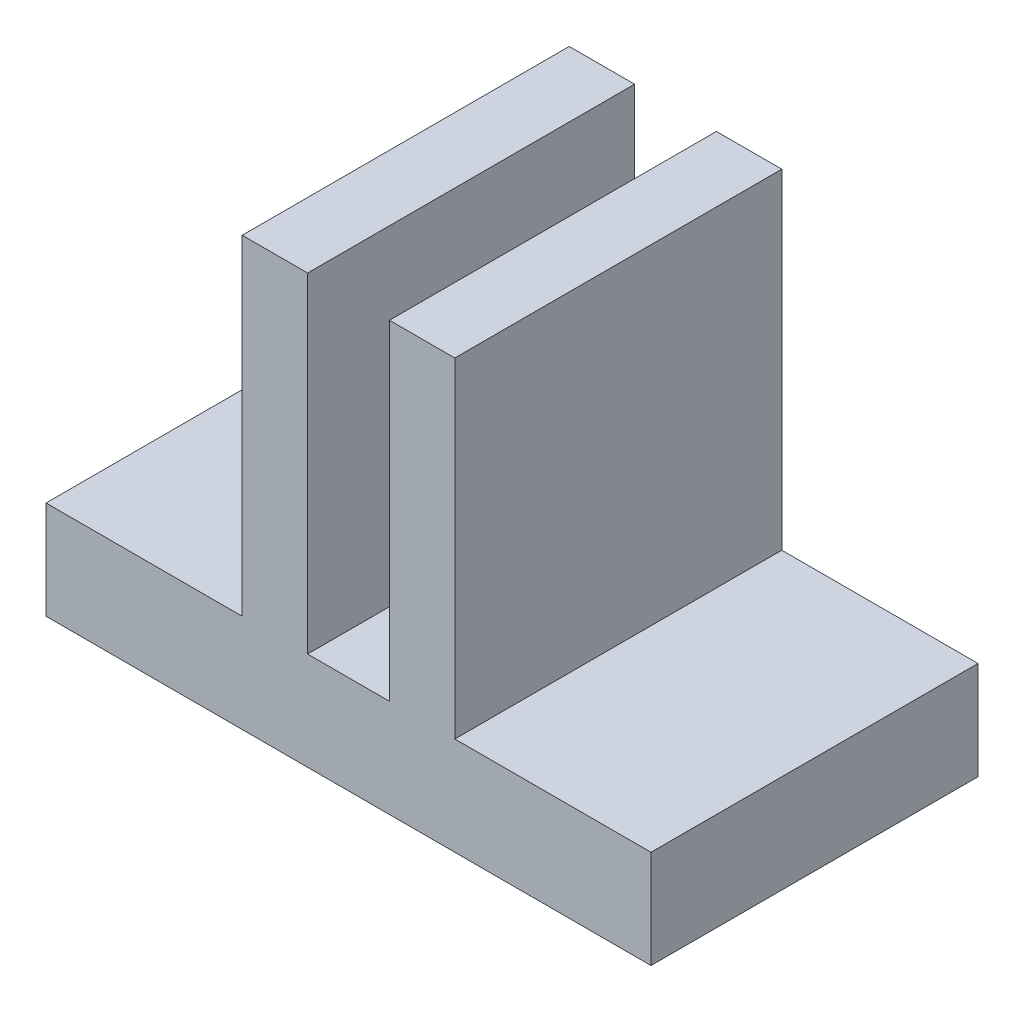
ISO-10303-21;
HEADER;
FILE_DESCRIPTION(('STEP AP214'),'2;1');
FILE_NAME('part.step','',(''),(''),'','','');
FILE_SCHEMA(('AUTOMOTIVE_DESIGN { 1 0 10303 214 1 1 1 1 }'));
ENDSEC;
DATA;
#1=APPLICATION_CONTEXT('core data for automotive mechanical design processes');
#2=APPLICATION_PROTOCOL_DEFINITION('international standard','automotive_design',2000,#1);
#3=PRODUCT_CONTEXT('',#1,'mechanical');
#4=PRODUCT('Part','Part','',(#3));
#5=PRODUCT_RELATED_PRODUCT_CATEGORY('part','',(#4));
#6=PRODUCT_DEFINITION_FORMATION('','',#4);
#7=PRODUCT_DEFINITION_CONTEXT('part definition',#1,'design');
#8=PRODUCT_DEFINITION('design','',#6,#7);
#9=PRODUCT_DEFINITION_SHAPE('','',#8);
#10=(LENGTH_UNIT() NAMED_UNIT(*) SI_UNIT(.MILLI.,.METRE.));
#11=(NAMED_UNIT(*) PLANE_ANGLE_UNIT() SI_UNIT($,.RADIAN.));
#12=(NAMED_UNIT(*) SI_UNIT($,.STERADIAN.) SOLID_ANGLE_UNIT());
#13=UNCERTAINTY_MEASURE_WITH_UNIT(LENGTH_MEASURE(1.E-05),#10,'distance_accuracy_value','');
#14=(GEOMETRIC_REPRESENTATION_CONTEXT(3) GLOBAL_UNCERTAINTY_ASSIGNED_CONTEXT((#13)) GLOBAL_UNIT_ASSIGNED_CONTEXT((#10,
#11,#12)) REPRESENTATION_CONTEXT('',''));
#15=CARTESIAN_POINT('',(0.,0.,0.));
#16=DIRECTION('',(0.,0.,1.));
#17=DIRECTION('',(1.,0.,0.));
#18=AXIS2_PLACEMENT_3D('',#15,#16,#17);
#19=CARTESIAN_POINT('',(-48.760088365243,-23.3378170512191,50.));
#20=DIRECTION('',(1.,0.,0.));
#21=DIRECTION('',(0.,0.,-1.));
#22=AXIS2_PLACEMENT_3D('',#19,#20,#21);
#23=PLANE('',#22);
#24=DIRECTION('',(0.,-1.,0.));
#25=VECTOR('',#24,1.);
#26=CARTESIAN_POINT('',(-48.760088365243,-23.3378170512191,0.));
#27=LINE('',#26,#25);
#28=CARTESIAN_POINT('',(-48.760088365243,-8.33781705121912,0.));
#29=VERTEX_POINT('',#28);
#30=CARTESIAN_POINT('',(-48.760088365243,-23.3378170512191,0.));
#31=VERTEX_POINT('',#30);
#32=EDGE_CURVE('E153',#29,#31,#27,.T.);
#33=ORIENTED_EDGE('',*,*,#32,.T.);
#34=DIRECTION('',(0.,0.,-1.));
#35=VECTOR('',#34,1.);
#36=CARTESIAN_POINT('',(-48.760088365243,-23.3378170512191,50.));
#37=LINE('',#36,#35);
#38=CARTESIAN_POINT('',(-48.760088365243,-23.3378170512191,50.));
#39=VERTEX_POINT('',#38);
#40=EDGE_CURVE('E11',#39,#31,#37,.T.);
#41=ORIENTED_EDGE('',*,*,#40,.F.);
#42=DIRECTION('',(0.,-1.,0.));
#43=VECTOR('',#42,1.);
#44=CARTESIAN_POINT('',(-48.760088365243,-23.3378170512191,50.));
#45=LINE('',#44,#43);
#46=CARTESIAN_POINT('',(-48.760088365243,-8.33781705121912,50.));
#47=VERTEX_POINT('',#46);
#48=EDGE_CURVE('E175',#47,#39,#45,.T.);
#49=ORIENTED_EDGE('',*,*,#48,.F.);
#50=DIRECTION('',(0.,0.,-1.));
#51=VECTOR('',#50,1.);
#52=CARTESIAN_POINT('',(-48.760088365243,-8.33781705121912,50.));
#53=LINE('',#52,#51);
#54=EDGE_CURVE('E149',#47,#29,#53,.T.);
#55=ORIENTED_EDGE('',*,*,#54,.T.);
#56=EDGE_LOOP('',(#33,#41,#49,#55));
#57=FACE_BOUND('',#56,.T.);
#58=ADVANCED_FACE('F33',(#57),#23,.F.);
#59=CARTESIAN_POINT('',(43.7466372115857,-23.3378170512191,50.));
#60=DIRECTION('',(0.,1.,0.));
#61=DIRECTION('',(-1.,0.,0.));
#62=AXIS2_PLACEMENT_3D('',#59,#60,#61);
#63=PLANE('',#62);
#64=DIRECTION('',(1.,0.,0.));
#65=VECTOR('',#64,1.);
#66=CARTESIAN_POINT('',(43.7466372115857,-23.3378170512191,0.));
#67=LINE('',#66,#65);
#68=CARTESIAN_POINT('',(43.7466372115857,-23.3378170512191,0.));
#69=VERTEX_POINT('',#68);
#70=EDGE_CURVE('E156',#31,#69,#67,.T.);
#71=ORIENTED_EDGE('',*,*,#70,.T.);
#72=DIRECTION('',(0.,0.,-1.));
#73=VECTOR('',#72,1.);
#74=CARTESIAN_POINT('',(43.7466372115857,-23.3378170512191,50.));
#75=LINE('',#74,#73);
#76=CARTESIAN_POINT('',(43.7466372115857,-23.3378170512191,50.));
#77=VERTEX_POINT('',#76);
#78=EDGE_CURVE('E41',#77,#69,#75,.T.);
#79=ORIENTED_EDGE('',*,*,#78,.F.);
#80=DIRECTION('',(1.,0.,0.));
#81=VECTOR('',#80,1.);
#82=CARTESIAN_POINT('',(43.7466372115857,-23.3378170512191,50.));
#83=LINE('',#82,#81);
#84=EDGE_CURVE('E104',#39,#77,#83,.T.);
#85=ORIENTED_EDGE('',*,*,#84,.F.);
#86=ORIENTED_EDGE('',*,*,#40,.T.);
#87=EDGE_LOOP('',(#71,#79,#85,#86));
#88=FACE_BOUND('',#87,.T.);
#89=ADVANCED_FACE('F253',(#88),#63,.F.);
#90=CARTESIAN_POINT('',(43.7466372115857,-8.33781705121912,50.));
#91=DIRECTION('',(-1.,0.,0.));
#92=DIRECTION('',(0.,0.,1.));
#93=AXIS2_PLACEMENT_3D('',#90,#91,#92);
#94=PLANE('',#93);
#95=DIRECTION('',(0.,1.,0.));
#96=VECTOR('',#95,1.);
#97=CARTESIAN_POINT('',(43.7466372115857,-8.33781705121912,0.));
#98=LINE('',#97,#96);
#99=CARTESIAN_POINT('',(43.7466372115857,-8.33781705121912,0.));
#100=VERTEX_POINT('',#99);
#101=EDGE_CURVE('E158',#69,#100,#98,.T.);
#102=ORIENTED_EDGE('',*,*,#101,.T.);
#103=DIRECTION('',(0.,0.,-1.));
#104=VECTOR('',#103,1.);
#105=CARTESIAN_POINT('',(43.7466372115857,-8.33781705121912,50.));
#106=LINE('',#105,#104);
#107=CARTESIAN_POINT('',(43.7466372115857,-8.33781705121912,50.));
#108=VERTEX_POINT('',#107);
#109=EDGE_CURVE('E194',#108,#100,#106,.T.);
#110=ORIENTED_EDGE('',*,*,#109,.F.);
#111=DIRECTION('',(0.,1.,0.));
#112=VECTOR('',#111,1.);
#113=CARTESIAN_POINT('',(43.7466372115857,-8.33781705121912,50.));
#114=LINE('',#113,#112);
#115=EDGE_CURVE('E202',#77,#108,#114,.T.);
#116=ORIENTED_EDGE('',*,*,#115,.F.);
#117=ORIENTED_EDGE('',*,*,#78,.T.);
#118=EDGE_LOOP('',(#102,#110,#116,#117));
#119=FACE_BOUND('',#118,.T.);
#120=ADVANCED_FACE('F200',(#119),#94,.F.);
#121=CARTESIAN_POINT('',(13.7466372115857,-8.33781705121912,50.));
#122=DIRECTION('',(0.,-1.,0.));
#123=DIRECTION('',(0.,0.,-1.));
#124=AXIS2_PLACEMENT_3D('',#121,#122,#123);
#125=PLANE('',#124);
#126=DIRECTION('',(-1.,0.,0.));
#127=VECTOR('',#126,1.);
#128=CARTESIAN_POINT('',(13.7466372115857,-8.33781705121912,0.));
#129=LINE('',#128,#127);
#130=CARTESIAN_POINT('',(13.7466372115857,-8.33781705121912,0.));
#131=VERTEX_POINT('',#130);
#132=EDGE_CURVE('E160',#100,#131,#129,.T.);
#133=ORIENTED_EDGE('',*,*,#132,.T.);
#134=DIRECTION('',(0.,0.,-1.));
#135=VECTOR('',#134,1.);
#136=CARTESIAN_POINT('',(13.7466372115857,-8.33781705121912,50.));
#137=LINE('',#136,#135);
#138=CARTESIAN_POINT('',(13.7466372115857,-8.33781705121912,50.));
#139=VERTEX_POINT('',#138);
#140=EDGE_CURVE('E191',#139,#131,#137,.T.);
#141=ORIENTED_EDGE('',*,*,#140,.F.);
#142=DIRECTION('',(-1.,0.,0.));
#143=VECTOR('',#142,1.);
#144=CARTESIAN_POINT('',(13.7466372115857,-8.33781705121912,50.));
#145=LINE('',#144,#143);
#146=EDGE_CURVE('E220',#108,#139,#145,.T.);
#147=ORIENTED_EDGE('',*,*,#146,.F.);
#148=ORIENTED_EDGE('',*,*,#109,.T.);
#149=EDGE_LOOP('',(#133,#141,#147,#148));
#150=FACE_BOUND('',#149,.T.);
#151=ADVANCED_FACE('F211',(#150),#125,.F.);
#152=CARTESIAN_POINT('',(13.7466372115857,42.1161607452228,50.));
#153=DIRECTION('',(-1.,0.,0.));
#154=DIRECTION('',(0.,0.,1.));
#155=AXIS2_PLACEMENT_3D('',#152,#153,#154);
#156=PLANE('',#155);
#157=DIRECTION('',(0.,1.,0.));
#158=VECTOR('',#157,1.);
#159=CARTESIAN_POINT('',(13.7466372115857,42.1161607452228,0.));
#160=LINE('',#159,#158);
#161=CARTESIAN_POINT('',(13.7466372115857,42.1161607452228,0.));
#162=VERTEX_POINT('',#161);
#163=EDGE_CURVE('E162',#131,#162,#160,.T.);
#164=ORIENTED_EDGE('',*,*,#163,.T.);
#165=DIRECTION('',(0.,0.,-1.));
#166=VECTOR('',#165,1.);
#167=CARTESIAN_POINT('',(13.7466372115857,42.1161607452228,50.));
#168=LINE('',#167,#166);
#169=CARTESIAN_POINT('',(13.7466372115857,42.1161607452228,50.));
#170=VERTEX_POINT('',#169);
#171=EDGE_CURVE('E188',#170,#162,#168,.T.);
#172=ORIENTED_EDGE('',*,*,#171,.F.);
#173=DIRECTION('',(0.,1.,0.));
#174=VECTOR('',#173,1.);
#175=CARTESIAN_POINT('',(13.7466372115857,42.1161607452228,50.));
#176=LINE('',#175,#174);
#177=EDGE_CURVE('E217',#139,#170,#176,.T.);
#178=ORIENTED_EDGE('',*,*,#177,.F.);
#179=ORIENTED_EDGE('',*,*,#140,.T.);
#180=EDGE_LOOP('',(#164,#172,#178,#179));
#181=FACE_BOUND('',#180,.T.);
#182=ADVANCED_FACE('F215',(#181),#156,.F.);
#183=CARTESIAN_POINT('',(3.74663721158569,42.1161607452228,50.));
#184=DIRECTION('',(0.,-1.,0.));
#185=DIRECTION('',(0.,0.,-1.));
#186=AXIS2_PLACEMENT_3D('',#183,#184,#185);
#187=PLANE('',#186);
#188=DIRECTION('',(-1.,0.,0.));
#189=VECTOR('',#188,1.);
#190=CARTESIAN_POINT('',(3.74663721158569,42.1161607452228,0.));
#191=LINE('',#190,#189);
#192=CARTESIAN_POINT('',(3.74663721158569,42.1161607452228,0.));
#193=VERTEX_POINT('',#192);
#194=EDGE_CURVE('E164',#162,#193,#191,.T.);
#195=ORIENTED_EDGE('',*,*,#194,.T.);
#196=DIRECTION('',(0.,0.,-1.));
#197=VECTOR('',#196,1.);
#198=CARTESIAN_POINT('',(3.74663721158569,42.1161607452228,50.));
#199=LINE('',#198,#197);
#200=CARTESIAN_POINT('',(3.74663721158569,42.1161607452228,50.));
#201=VERTEX_POINT('',#200);
#202=EDGE_CURVE('E185',#201,#193,#199,.T.);
#203=ORIENTED_EDGE('',*,*,#202,.F.);
#204=DIRECTION('',(-1.,0.,0.));
#205=VECTOR('',#204,1.);
#206=CARTESIAN_POINT('',(3.74663721158569,42.1161607452228,50.));
#207=LINE('',#206,#205);
#208=EDGE_CURVE('E219',#170,#201,#207,.T.);
#209=ORIENTED_EDGE('',*,*,#208,.F.);
#210=ORIENTED_EDGE('',*,*,#171,.T.);
#211=EDGE_LOOP('',(#195,#203,#209,#210));
#212=FACE_BOUND('',#211,.T.);
#213=ADVANCED_FACE('F266',(#212),#187,.F.);
#214=CARTESIAN_POINT('',(3.74663721158569,-8.33781705121912,50.));
#215=DIRECTION('',(1.,0.,0.));
#216=DIRECTION('',(0.,0.,-1.));
#217=AXIS2_PLACEMENT_3D('',#214,#215,#216);
#218=PLANE('',#217);
#219=DIRECTION('',(0.,-1.,0.));
#220=VECTOR('',#219,1.);
#221=CARTESIAN_POINT('',(3.74663721158569,-8.33781705121912,0.));
#222=LINE('',#221,#220);
#223=CARTESIAN_POINT('',(3.74663721158569,-8.33781705121912,0.));
#224=VERTEX_POINT('',#223);
#225=EDGE_CURVE('E166',#193,#224,#222,.T.);
#226=ORIENTED_EDGE('',*,*,#225,.T.);
#227=DIRECTION('',(0.,0.,-1.));
#228=VECTOR('',#227,1.);
#229=CARTESIAN_POINT('',(3.74663721158569,-8.33781705121912,50.));
#230=LINE('',#229,#228);
#231=CARTESIAN_POINT('',(3.74663721158569,-8.33781705121912,50.));
#232=VERTEX_POINT('',#231);
#233=EDGE_CURVE('E182',#232,#224,#230,.T.);
#234=ORIENTED_EDGE('',*,*,#233,.F.);
#235=DIRECTION('',(0.,-1.,0.));
#236=VECTOR('',#235,1.);
#237=CARTESIAN_POINT('',(3.74663721158569,-8.33781705121912,50.));
#238=LINE('',#237,#236);
#239=EDGE_CURVE('E222',#201,#232,#238,.T.);
#240=ORIENTED_EDGE('',*,*,#239,.F.);
#241=ORIENTED_EDGE('',*,*,#202,.T.);
#242=EDGE_LOOP('',(#226,#234,#240,#241));
#243=FACE_BOUND('',#242,.T.);
#244=ADVANCED_FACE('F269',(#243),#218,.F.);
#245=CARTESIAN_POINT('',(-8.76008836524298,-8.33781705121912,50.));
#246=DIRECTION('',(0.,-1.,0.));
#247=DIRECTION('',(0.,0.,-1.));
#248=AXIS2_PLACEMENT_3D('',#245,#246,#247);
#249=PLANE('',#248);
#250=DIRECTION('',(-1.,0.,0.));
#251=VECTOR('',#250,1.);
#252=CARTESIAN_POINT('',(-8.76008836524298,-8.33781705121912,0.));
#253=LINE('',#252,#251);
#254=CARTESIAN_POINT('',(-8.76008836524298,-8.33781705121912,0.));
#255=VERTEX_POINT('',#254);
#256=EDGE_CURVE('E168',#224,#255,#253,.T.);
#257=ORIENTED_EDGE('',*,*,#256,.T.);
#258=DIRECTION('',(0.,0.,-1.));
#259=VECTOR('',#258,1.);
#260=CARTESIAN_POINT('',(-8.76008836524298,-8.33781705121912,50.));
#261=LINE('',#260,#259);
#262=CARTESIAN_POINT('',(-8.76008836524298,-8.33781705121912,50.));
#263=VERTEX_POINT('',#262);
#264=EDGE_CURVE('E179',#263,#255,#261,.T.);
#265=ORIENTED_EDGE('',*,*,#264,.F.);
#266=DIRECTION('',(-1.,0.,0.));
#267=VECTOR('',#266,1.);
#268=CARTESIAN_POINT('',(-8.76008836524298,-8.33781705121912,50.));
#269=LINE('',#268,#267);
#270=EDGE_CURVE('E228',#232,#263,#269,.T.);
#271=ORIENTED_EDGE('',*,*,#270,.F.);
#272=ORIENTED_EDGE('',*,*,#233,.T.);
#273=EDGE_LOOP('',(#257,#265,#271,#272));
#274=FACE_BOUND('',#273,.T.);
#275=ADVANCED_FACE('F234',(#274),#249,.F.);
#276=CARTESIAN_POINT('',(-8.76008836524298,42.1161607452228,50.));
#277=DIRECTION('',(-1.,0.,0.));
#278=DIRECTION('',(0.,0.,1.));
#279=AXIS2_PLACEMENT_3D('',#276,#277,#278);
#280=PLANE('',#279);
#281=DIRECTION('',(0.,1.,0.));
#282=VECTOR('',#281,1.);
#283=CARTESIAN_POINT('',(-8.76008836524298,42.1161607452228,0.));
#284=LINE('',#283,#282);
#285=CARTESIAN_POINT('',(-8.76008836524298,42.1161607452228,0.));
#286=VERTEX_POINT('',#285);
#287=EDGE_CURVE('E170',#255,#286,#284,.T.);
#288=ORIENTED_EDGE('',*,*,#287,.T.);
#289=DIRECTION('',(0.,0.,-1.));
#290=VECTOR('',#289,1.);
#291=CARTESIAN_POINT('',(-8.76008836524298,42.1161607452228,50.));
#292=LINE('',#291,#290);
#293=CARTESIAN_POINT('',(-8.76008836524298,42.1161607452228,50.));
#294=VERTEX_POINT('',#293);
#295=EDGE_CURVE('E144',#294,#286,#292,.T.);
#296=ORIENTED_EDGE('',*,*,#295,.F.);
#297=DIRECTION('',(0.,1.,0.));
#298=VECTOR('',#297,1.);
#299=CARTESIAN_POINT('',(-8.76008836524298,42.1161607452228,50.));
#300=LINE('',#299,#298);
#301=EDGE_CURVE('E135',#263,#294,#300,.T.);
#302=ORIENTED_EDGE('',*,*,#301,.F.);
#303=ORIENTED_EDGE('',*,*,#264,.T.);
#304=EDGE_LOOP('',(#288,#296,#302,#303));
#305=FACE_BOUND('',#304,.T.);
#306=ADVANCED_FACE('F238',(#305),#280,.F.);
#307=CARTESIAN_POINT('',(-18.760088365243,42.1161607452228,50.));
#308=DIRECTION('',(0.,-1.,0.));
#309=DIRECTION('',(0.,0.,-1.));
#310=AXIS2_PLACEMENT_3D('',#307,#308,#309);
#311=PLANE('',#310);
#312=DIRECTION('',(-1.,0.,0.));
#313=VECTOR('',#312,1.);
#314=CARTESIAN_POINT('',(-18.760088365243,42.1161607452228,0.));
#315=LINE('',#314,#313);
#316=CARTESIAN_POINT('',(-18.760088365243,42.1161607452228,0.));
#317=VERTEX_POINT('',#316);
#318=EDGE_CURVE('E143',#286,#317,#315,.T.);
#319=ORIENTED_EDGE('',*,*,#318,.T.);
#320=DIRECTION('',(0.,0.,-1.));
#321=VECTOR('',#320,1.);
#322=CARTESIAN_POINT('',(-18.760088365243,42.1161607452228,50.));
#323=LINE('',#322,#321);
#324=CARTESIAN_POINT('',(-18.760088365243,42.1161607452228,50.));
#325=VERTEX_POINT('',#324);
#326=EDGE_CURVE('E140',#325,#317,#323,.T.);
#327=ORIENTED_EDGE('',*,*,#326,.F.);
#328=DIRECTION('',(-1.,0.,0.));
#329=VECTOR('',#328,1.);
#330=CARTESIAN_POINT('',(-18.760088365243,42.1161607452228,50.));
#331=LINE('',#330,#329);
#332=EDGE_CURVE('E129',#294,#325,#331,.T.);
#333=ORIENTED_EDGE('',*,*,#332,.F.);
#334=ORIENTED_EDGE('',*,*,#295,.T.);
#335=EDGE_LOOP('',(#319,#327,#333,#334));
#336=FACE_BOUND('',#335,.T.);
#337=ADVANCED_FACE('F141',(#336),#311,.F.);
#338=CARTESIAN_POINT('',(-18.760088365243,-8.33781705121912,50.));
#339=DIRECTION('',(1.,0.,0.));
#340=DIRECTION('',(0.,0.,-1.));
#341=AXIS2_PLACEMENT_3D('',#338,#339,#340);
#342=PLANE('',#341);
#343=DIRECTION('',(0.,-1.,0.));
#344=VECTOR('',#343,1.);
#345=CARTESIAN_POINT('',(-18.760088365243,-8.33781705121912,0.));
#346=LINE('',#345,#344);
#347=CARTESIAN_POINT('',(-18.760088365243,-8.33781705121912,0.));
#348=VERTEX_POINT('',#347);
#349=EDGE_CURVE('E90',#317,#348,#346,.T.);
#350=ORIENTED_EDGE('',*,*,#349,.T.);
#351=DIRECTION('',(0.,0.,-1.));
#352=VECTOR('',#351,1.);
#353=CARTESIAN_POINT('',(-18.760088365243,-8.33781705121912,50.));
#354=LINE('',#353,#352);
#355=CARTESIAN_POINT('',(-18.760088365243,-8.33781705121912,50.));
#356=VERTEX_POINT('',#355);
#357=EDGE_CURVE('E145',#356,#348,#354,.T.);
#358=ORIENTED_EDGE('',*,*,#357,.F.);
#359=DIRECTION('',(0.,-1.,0.));
#360=VECTOR('',#359,1.);
#361=CARTESIAN_POINT('',(-18.760088365243,-8.33781705121912,50.));
#362=LINE('',#361,#360);
#363=EDGE_CURVE('E133',#325,#356,#362,.T.);
#364=ORIENTED_EDGE('',*,*,#363,.F.);
#365=ORIENTED_EDGE('',*,*,#326,.T.);
#366=EDGE_LOOP('',(#350,#358,#364,#365));
#367=FACE_BOUND('',#366,.T.);
#368=ADVANCED_FACE('F147',(#367),#342,.F.);
#369=CARTESIAN_POINT('',(-48.760088365243,-8.33781705121912,50.));
#370=DIRECTION('',(0.,-1.,0.));
#371=DIRECTION('',(0.,0.,-1.));
#372=AXIS2_PLACEMENT_3D('',#369,#370,#371);
#373=PLANE('',#372);
#374=DIRECTION('',(-1.,0.,0.));
#375=VECTOR('',#374,1.);
#376=CARTESIAN_POINT('',(-48.760088365243,-8.33781705121912,0.));
#377=LINE('',#376,#375);
#378=EDGE_CURVE('E96',#348,#29,#377,.T.);
#379=ORIENTED_EDGE('',*,*,#378,.T.);
#380=ORIENTED_EDGE('',*,*,#54,.F.);
#381=DIRECTION('',(-1.,0.,0.));
#382=VECTOR('',#381,1.);
#383=CARTESIAN_POINT('',(-48.760088365243,-8.33781705121912,50.));
#384=LINE('',#383,#382);
#385=EDGE_CURVE('E49',#356,#47,#384,.T.);
#386=ORIENTED_EDGE('',*,*,#385,.F.);
#387=ORIENTED_EDGE('',*,*,#357,.T.);
#388=EDGE_LOOP('',(#379,#380,#386,#387));
#389=FACE_BOUND('',#388,.T.);
#390=ADVANCED_FACE('F242',(#389),#373,.F.);
#391=CARTESIAN_POINT('',(0.,0.,50.));
#392=DIRECTION('',(0.,0.,-1.));
#393=DIRECTION('',(-1.,0.,0.));
#394=AXIS2_PLACEMENT_3D('',#391,#392,#393);
#395=PLANE('',#394);
#396=ORIENTED_EDGE('',*,*,#48,.T.);
#397=ORIENTED_EDGE('',*,*,#84,.T.);
#398=ORIENTED_EDGE('',*,*,#115,.T.);
#399=ORIENTED_EDGE('',*,*,#146,.T.);
#400=ORIENTED_EDGE('',*,*,#177,.T.);
#401=ORIENTED_EDGE('',*,*,#208,.T.);
#402=ORIENTED_EDGE('',*,*,#239,.T.);
#403=ORIENTED_EDGE('',*,*,#270,.T.);
#404=ORIENTED_EDGE('',*,*,#301,.T.);
#405=ORIENTED_EDGE('',*,*,#332,.T.);
#406=ORIENTED_EDGE('',*,*,#363,.T.);
#407=ORIENTED_EDGE('',*,*,#385,.T.);
#408=EDGE_LOOP('',(#396,#397,#398,#399,#400,#401,#402,#403,#404,#405,#406,#407));
#409=FACE_BOUND('',#408,.T.);
#410=ADVANCED_FACE('F131',(#409),#395,.F.);
#411=CARTESIAN_POINT('',(0.,0.,0.));
#412=DIRECTION('',(0.,0.,-1.));
#413=DIRECTION('',(-1.,0.,0.));
#414=AXIS2_PLACEMENT_3D('',#411,#412,#413);
#415=PLANE('',#414);
#416=ORIENTED_EDGE('',*,*,#32,.F.);
#417=ORIENTED_EDGE('',*,*,#378,.F.);
#418=ORIENTED_EDGE('',*,*,#349,.F.);
#419=ORIENTED_EDGE('',*,*,#318,.F.);
#420=ORIENTED_EDGE('',*,*,#287,.F.);
#421=ORIENTED_EDGE('',*,*,#256,.F.);
#422=ORIENTED_EDGE('',*,*,#225,.F.);
#423=ORIENTED_EDGE('',*,*,#194,.F.);
#424=ORIENTED_EDGE('',*,*,#163,.F.);
#425=ORIENTED_EDGE('',*,*,#132,.F.);
#426=ORIENTED_EDGE('',*,*,#101,.F.);
#427=ORIENTED_EDGE('',*,*,#70,.F.);
#428=EDGE_LOOP('',(#416,#417,#418,#419,#420,#421,#422,#423,#424,#425,#426,#427));
#429=FACE_BOUND('',#428,.T.);
#430=ADVANCED_FACE('F206',(#429),#415,.T.);
#431=CLOSED_SHELL('',(#58,#89,#120,#151,#182,#213,#244,#275,#306,#337,#368,#390,#410,#430));
#432=MANIFOLD_SOLID_BREP('B2',#431);
#433=ADVANCED_BREP_SHAPE_REPRESENTATION('',(#18,#432),#14);
#434=SHAPE_DEFINITION_REPRESENTATION(#9,#433);
ENDSEC;
END-ISO-10303-21;
